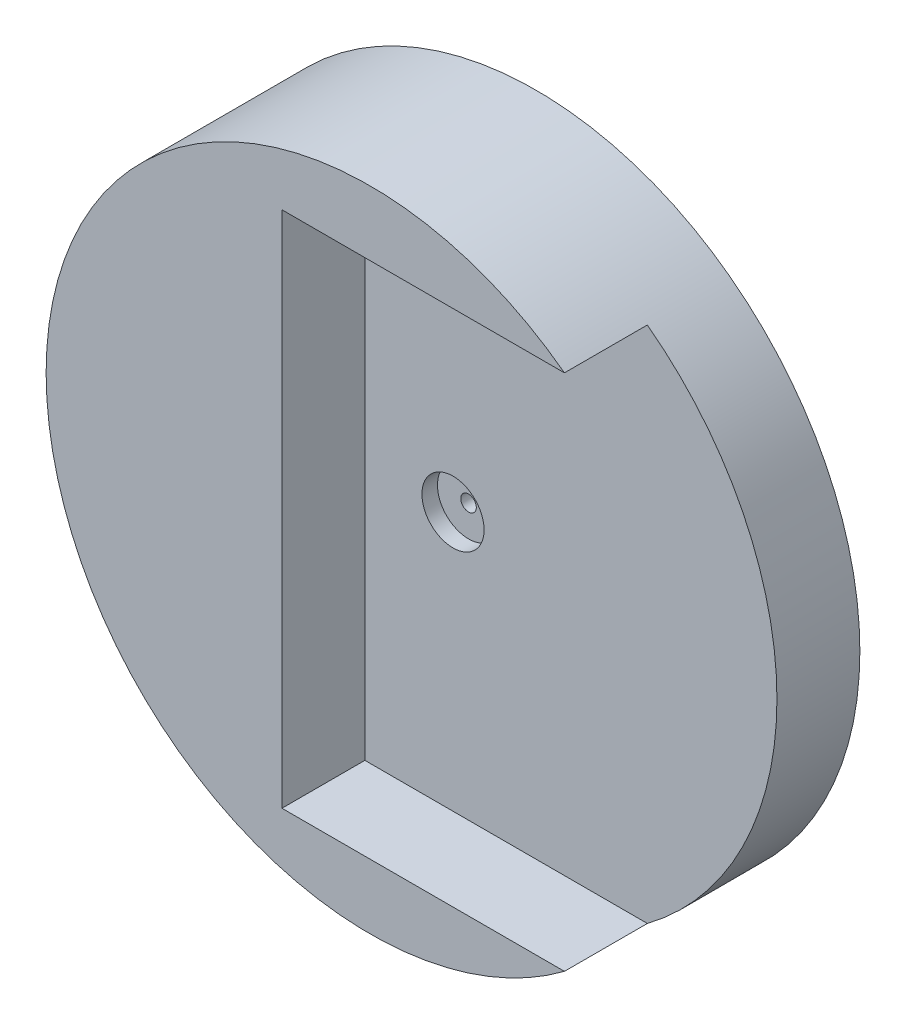
ISO-10303-21;
HEADER;
FILE_DESCRIPTION(('STEP AP214'),'2;1');
FILE_NAME('part.step','',(''),(''),'','','');
FILE_SCHEMA(('AUTOMOTIVE_DESIGN { 1 0 10303 214 1 1 1 1 }'));
ENDSEC;
DATA;
#1=APPLICATION_CONTEXT('core data for automotive mechanical design processes');
#2=APPLICATION_PROTOCOL_DEFINITION('international standard','automotive_design',2000,#1);
#3=PRODUCT_CONTEXT('',#1,'mechanical');
#4=PRODUCT('Part','Part','',(#3));
#5=PRODUCT_RELATED_PRODUCT_CATEGORY('part','',(#4));
#6=PRODUCT_DEFINITION_FORMATION('','',#4);
#7=PRODUCT_DEFINITION_CONTEXT('part definition',#1,'design');
#8=PRODUCT_DEFINITION('design','',#6,#7);
#9=PRODUCT_DEFINITION_SHAPE('','',#8);
#10=(LENGTH_UNIT() NAMED_UNIT(*) SI_UNIT(.MILLI.,.METRE.));
#11=(NAMED_UNIT(*) PLANE_ANGLE_UNIT() SI_UNIT($,.RADIAN.));
#12=(NAMED_UNIT(*) SI_UNIT($,.STERADIAN.) SOLID_ANGLE_UNIT());
#13=UNCERTAINTY_MEASURE_WITH_UNIT(LENGTH_MEASURE(1.E-05),#10,'distance_accuracy_value','');
#14=(GEOMETRIC_REPRESENTATION_CONTEXT(3) GLOBAL_UNCERTAINTY_ASSIGNED_CONTEXT((#13)) GLOBAL_UNIT_ASSIGNED_CONTEXT((#10,
#11,#12)) REPRESENTATION_CONTEXT('',''));
#15=CARTESIAN_POINT('',(0.,0.,0.));
#16=DIRECTION('',(0.,0.,1.));
#17=DIRECTION('',(1.,0.,0.));
#18=AXIS2_PLACEMENT_3D('',#15,#16,#17);
#19=CARTESIAN_POINT('',(0.,0.,32.));
#20=DIRECTION('',(0.,0.,-1.));
#21=DIRECTION('',(-1.,0.,0.));
#22=AXIS2_PLACEMENT_3D('',#19,#20,#21);
#23=CYLINDRICAL_SURFACE('',#22,1.5);
#24=CARTESIAN_POINT('',(0.,0.,10.));
#25=DIRECTION('',(0.,0.,-1.));
#26=DIRECTION('',(-1.,0.,0.));
#27=AXIS2_PLACEMENT_3D('',#24,#25,#26);
#28=CIRCLE('',#27,1.5);
#29=CARTESIAN_POINT('',(-1.5,0.,10.));
#30=VERTEX_POINT('',#29);
#31=EDGE_CURVE('E109',#30,#30,#28,.T.);
#32=ORIENTED_EDGE('',*,*,#31,.T.);
#33=EDGE_LOOP('',(#32));
#34=FACE_BOUND('',#33,.T.);
#35=CARTESIAN_POINT('',(0.,0.,13.));
#36=DIRECTION('',(0.,0.,1.));
#37=DIRECTION('',(1.,0.,0.));
#38=AXIS2_PLACEMENT_3D('',#35,#36,#37);
#39=CIRCLE('',#38,1.5);
#40=CARTESIAN_POINT('',(1.5,0.,13.));
#41=VERTEX_POINT('',#40);
#42=EDGE_CURVE('E37',#41,#41,#39,.F.);
#43=ORIENTED_EDGE('',*,*,#42,.F.);
#44=EDGE_LOOP('',(#43));
#45=FACE_BOUND('',#44,.T.);
#46=ADVANCED_FACE('F33',(#34,#45),#23,.F.);
#47=CARTESIAN_POINT('',(0.,0.,0.));
#48=DIRECTION('',(0.,0.,1.));
#49=DIRECTION('',(1.,0.,0.));
#50=AXIS2_PLACEMENT_3D('',#47,#48,#49);
#51=PLANE('',#50);
#52=CARTESIAN_POINT('',(0.,0.,0.));
#53=DIRECTION('',(0.,0.,1.));
#54=DIRECTION('',(1.,0.,0.));
#55=AXIS2_PLACEMENT_3D('',#52,#53,#54);
#56=CIRCLE('',#55,62.5);
#57=CARTESIAN_POINT('',(62.5,0.,0.));
#58=VERTEX_POINT('',#57);
#59=EDGE_CURVE('E11',#58,#58,#56,.T.);
#60=ORIENTED_EDGE('',*,*,#59,.F.);
#61=EDGE_LOOP('',(#60));
#62=FACE_BOUND('',#61,.T.);
#63=CARTESIAN_POINT('',(0.,0.,0.));
#64=DIRECTION('',(0.,0.,1.));
#65=DIRECTION('',(1.,0.,0.));
#66=AXIS2_PLACEMENT_3D('',#63,#64,#65);
#67=CIRCLE('',#66,57.5);
#68=CARTESIAN_POINT('',(57.5,0.,0.));
#69=VERTEX_POINT('',#68);
#70=EDGE_CURVE('E42',#69,#69,#67,.T.);
#71=ORIENTED_EDGE('',*,*,#70,.T.);
#72=EDGE_LOOP('',(#71));
#73=FACE_BOUND('',#72,.T.);
#74=ADVANCED_FACE('F121',(#62,#73),#51,.F.);
#75=CARTESIAN_POINT('',(0.,0.,10.));
#76=DIRECTION('',(0.,0.,-1.));
#77=DIRECTION('',(-1.,0.,0.));
#78=AXIS2_PLACEMENT_3D('',#75,#76,#77);
#79=CYLINDRICAL_SURFACE('',#78,62.5);
#80=CARTESIAN_POINT('',(0.,0.,32.));
#81=DIRECTION('',(0.,0.,1.));
#82=DIRECTION('',(1.,0.,0.));
#83=AXIS2_PLACEMENT_3D('',#80,#81,#82);
#84=CIRCLE('',#83,62.5);
#85=CARTESIAN_POINT('',(37.5,50.,32.));
#86=VERTEX_POINT('',#85);
#87=CARTESIAN_POINT('',(37.5,-50.,32.));
#88=VERTEX_POINT('',#87);
#89=EDGE_CURVE('E112',#86,#88,#84,.T.);
#90=ORIENTED_EDGE('',*,*,#89,.F.);
#91=DIRECTION('',(0.,0.,-1.));
#92=VECTOR('',#91,1.);
#93=CARTESIAN_POINT('',(37.5,50.,10.));
#94=LINE('',#93,#92);
#95=CARTESIAN_POINT('',(37.5,50.,16.));
#96=VERTEX_POINT('',#95);
#97=EDGE_CURVE('E106',#86,#96,#94,.T.);
#98=ORIENTED_EDGE('',*,*,#97,.T.);
#99=CARTESIAN_POINT('',(0.,0.,16.));
#100=DIRECTION('',(0.,0.,1.));
#101=DIRECTION('',(1.,0.,0.));
#102=AXIS2_PLACEMENT_3D('',#99,#100,#101);
#103=CIRCLE('',#102,62.5);
#104=CARTESIAN_POINT('',(37.5,-50.,16.));
#105=VERTEX_POINT('',#104);
#106=EDGE_CURVE('E102',#105,#96,#103,.T.);
#107=ORIENTED_EDGE('',*,*,#106,.F.);
#108=DIRECTION('',(0.,0.,-1.));
#109=VECTOR('',#108,1.);
#110=CARTESIAN_POINT('',(37.5,-50.,10.));
#111=LINE('',#110,#109);
#112=EDGE_CURVE('E57',#105,#88,#111,.F.);
#113=ORIENTED_EDGE('',*,*,#112,.T.);
#114=EDGE_LOOP('',(#90,#98,#107,#113));
#115=FACE_BOUND('',#114,.T.);
#116=ORIENTED_EDGE('',*,*,#59,.T.);
#117=EDGE_LOOP('',(#116));
#118=FACE_BOUND('',#117,.T.);
#119=ADVANCED_FACE('F35',(#115,#118),#79,.T.);
#120=CARTESIAN_POINT('',(0.,0.,10.));
#121=DIRECTION('',(0.,0.,-1.));
#122=DIRECTION('',(-1.,0.,0.));
#123=AXIS2_PLACEMENT_3D('',#120,#121,#122);
#124=CYLINDRICAL_SURFACE('',#123,57.5);
#125=CARTESIAN_POINT('',(0.,0.,10.));
#126=DIRECTION('',(0.,0.,1.));
#127=DIRECTION('',(1.,0.,0.));
#128=AXIS2_PLACEMENT_3D('',#125,#126,#127);
#129=CIRCLE('',#128,57.5);
#130=CARTESIAN_POINT('',(57.5,0.,10.));
#131=VERTEX_POINT('',#130);
#132=EDGE_CURVE('E115',#131,#131,#129,.T.);
#133=ORIENTED_EDGE('',*,*,#132,.T.);
#134=EDGE_LOOP('',(#133));
#135=FACE_BOUND('',#134,.T.);
#136=ORIENTED_EDGE('',*,*,#70,.F.);
#137=EDGE_LOOP('',(#136));
#138=FACE_BOUND('',#137,.T.);
#139=ADVANCED_FACE('F123',(#135,#138),#124,.F.);
#140=CARTESIAN_POINT('',(0.,0.,10.));
#141=DIRECTION('',(0.,0.,1.));
#142=DIRECTION('',(1.,0.,0.));
#143=AXIS2_PLACEMENT_3D('',#140,#141,#142);
#144=PLANE('',#143);
#145=ORIENTED_EDGE('',*,*,#31,.F.);
#146=EDGE_LOOP('',(#145));
#147=FACE_BOUND('',#146,.T.);
#148=ORIENTED_EDGE('',*,*,#132,.F.);
#149=EDGE_LOOP('',(#148));
#150=FACE_BOUND('',#149,.T.);
#151=ADVANCED_FACE('F125',(#147,#150),#144,.F.);
#152=CARTESIAN_POINT('',(0.,0.,32.));
#153=DIRECTION('',(0.,0.,1.));
#154=DIRECTION('',(1.,0.,0.));
#155=AXIS2_PLACEMENT_3D('',#152,#153,#154);
#156=PLANE('',#155);
#157=DIRECTION('',(-1.,0.,0.));
#158=VECTOR('',#157,1.);
#159=CARTESIAN_POINT('',(-17.,50.,32.));
#160=LINE('',#159,#158);
#161=CARTESIAN_POINT('',(-17.,50.,32.));
#162=VERTEX_POINT('',#161);
#163=EDGE_CURVE('E91',#86,#162,#160,.T.);
#164=ORIENTED_EDGE('',*,*,#163,.F.);
#165=ORIENTED_EDGE('',*,*,#89,.T.);
#166=DIRECTION('',(1.,0.,0.));
#167=VECTOR('',#166,1.);
#168=CARTESIAN_POINT('',(-17.,-50.,32.));
#169=LINE('',#168,#167);
#170=CARTESIAN_POINT('',(-17.,-50.,32.));
#171=VERTEX_POINT('',#170);
#172=EDGE_CURVE('E93',#171,#88,#169,.T.);
#173=ORIENTED_EDGE('',*,*,#172,.F.);
#174=DIRECTION('',(0.,-1.,0.));
#175=VECTOR('',#174,1.);
#176=CARTESIAN_POINT('',(-17.,50.,32.));
#177=LINE('',#176,#175);
#178=EDGE_CURVE('E49',#162,#171,#177,.T.);
#179=ORIENTED_EDGE('',*,*,#178,.F.);
#180=EDGE_LOOP('',(#164,#165,#173,#179));
#181=FACE_BOUND('',#180,.T.);
#182=ADVANCED_FACE('F132',(#181),#156,.T.);
#183=CARTESIAN_POINT('',(-17.,50.,16.));
#184=DIRECTION('',(0.,1.,0.));
#185=DIRECTION('',(0.,0.,1.));
#186=AXIS2_PLACEMENT_3D('',#183,#184,#185);
#187=PLANE('',#186);
#188=ORIENTED_EDGE('',*,*,#163,.T.);
#189=DIRECTION('',(0.,0.,1.));
#190=VECTOR('',#189,1.);
#191=CARTESIAN_POINT('',(-17.,50.,16.));
#192=LINE('',#191,#190);
#193=CARTESIAN_POINT('',(-17.,50.,16.));
#194=VERTEX_POINT('',#193);
#195=EDGE_CURVE('E80',#194,#162,#192,.T.);
#196=ORIENTED_EDGE('',*,*,#195,.F.);
#197=DIRECTION('',(-1.,0.,0.));
#198=VECTOR('',#197,1.);
#199=CARTESIAN_POINT('',(-17.,50.,16.));
#200=LINE('',#199,#198);
#201=EDGE_CURVE('E81',#96,#194,#200,.T.);
#202=ORIENTED_EDGE('',*,*,#201,.F.);
#203=ORIENTED_EDGE('',*,*,#97,.F.);
#204=EDGE_LOOP('',(#188,#196,#202,#203));
#205=FACE_BOUND('',#204,.T.);
#206=ADVANCED_FACE('F148',(#205),#187,.F.);
#207=CARTESIAN_POINT('',(-17.,-50.,16.));
#208=DIRECTION('',(0.,-1.,0.));
#209=DIRECTION('',(1.,0.,0.));
#210=AXIS2_PLACEMENT_3D('',#207,#208,#209);
#211=PLANE('',#210);
#212=DIRECTION('',(1.,0.,0.));
#213=VECTOR('',#212,1.);
#214=CARTESIAN_POINT('',(-17.,-50.,16.));
#215=LINE('',#214,#213);
#216=CARTESIAN_POINT('',(-17.,-50.,16.));
#217=VERTEX_POINT('',#216);
#218=EDGE_CURVE('E83',#217,#105,#215,.T.);
#219=ORIENTED_EDGE('',*,*,#218,.F.);
#220=DIRECTION('',(0.,0.,1.));
#221=VECTOR('',#220,1.);
#222=CARTESIAN_POINT('',(-17.,-50.,16.));
#223=LINE('',#222,#221);
#224=EDGE_CURVE('E75',#217,#171,#223,.T.);
#225=ORIENTED_EDGE('',*,*,#224,.T.);
#226=ORIENTED_EDGE('',*,*,#172,.T.);
#227=ORIENTED_EDGE('',*,*,#112,.F.);
#228=EDGE_LOOP('',(#219,#225,#226,#227));
#229=FACE_BOUND('',#228,.T.);
#230=ADVANCED_FACE('F84',(#229),#211,.F.);
#231=CARTESIAN_POINT('',(0.,0.,16.));
#232=DIRECTION('',(0.,0.,1.));
#233=DIRECTION('',(1.,0.,0.));
#234=AXIS2_PLACEMENT_3D('',#231,#232,#233);
#235=PLANE('',#234);
#236=CARTESIAN_POINT('',(0.,0.,16.));
#237=DIRECTION('',(0.,0.,1.));
#238=DIRECTION('',(1.,0.,0.));
#239=AXIS2_PLACEMENT_3D('',#236,#237,#238);
#240=CIRCLE('',#239,6.);
#241=CARTESIAN_POINT('',(6.,0.,16.));
#242=VERTEX_POINT('',#241);
#243=EDGE_CURVE('E96',#242,#242,#240,.T.);
#244=ORIENTED_EDGE('',*,*,#243,.F.);
#245=EDGE_LOOP('',(#244));
#246=FACE_BOUND('',#245,.T.);
#247=ORIENTED_EDGE('',*,*,#106,.T.);
#248=ORIENTED_EDGE('',*,*,#201,.T.);
#249=DIRECTION('',(0.,-1.,0.));
#250=VECTOR('',#249,1.);
#251=CARTESIAN_POINT('',(-17.,50.,16.));
#252=LINE('',#251,#250);
#253=EDGE_CURVE('E78',#194,#217,#252,.T.);
#254=ORIENTED_EDGE('',*,*,#253,.T.);
#255=ORIENTED_EDGE('',*,*,#218,.T.);
#256=EDGE_LOOP('',(#247,#248,#254,#255));
#257=FACE_BOUND('',#256,.T.);
#258=ADVANCED_FACE('F88',(#246,#257),#235,.T.);
#259=CARTESIAN_POINT('',(-17.,50.,16.));
#260=DIRECTION('',(-1.,0.,0.));
#261=DIRECTION('',(0.,-1.,0.));
#262=AXIS2_PLACEMENT_3D('',#259,#260,#261);
#263=PLANE('',#262);
#264=ORIENTED_EDGE('',*,*,#178,.T.);
#265=ORIENTED_EDGE('',*,*,#224,.F.);
#266=ORIENTED_EDGE('',*,*,#253,.F.);
#267=ORIENTED_EDGE('',*,*,#195,.T.);
#268=EDGE_LOOP('',(#264,#265,#266,#267));
#269=FACE_BOUND('',#268,.T.);
#270=ADVANCED_FACE('F76',(#269),#263,.F.);
#271=CARTESIAN_POINT('',(0.,0.,13.));
#272=DIRECTION('',(0.,0.,1.));
#273=DIRECTION('',(1.,0.,0.));
#274=AXIS2_PLACEMENT_3D('',#271,#272,#273);
#275=PLANE('',#274);
#276=CARTESIAN_POINT('',(0.,0.,13.));
#277=DIRECTION('',(0.,0.,1.));
#278=DIRECTION('',(1.,0.,0.));
#279=AXIS2_PLACEMENT_3D('',#276,#277,#278);
#280=CIRCLE('',#279,6.);
#281=CARTESIAN_POINT('',(6.,0.,13.));
#282=VERTEX_POINT('',#281);
#283=EDGE_CURVE('E179',#282,#282,#280,.T.);
#284=ORIENTED_EDGE('',*,*,#283,.T.);
#285=EDGE_LOOP('',(#284));
#286=FACE_BOUND('',#285,.T.);
#287=ORIENTED_EDGE('',*,*,#42,.T.);
#288=EDGE_LOOP('',(#287));
#289=FACE_BOUND('',#288,.T.);
#290=ADVANCED_FACE('F169',(#286,#289),#275,.T.);
#291=CARTESIAN_POINT('',(0.,0.,13.));
#292=DIRECTION('',(0.,0.,1.));
#293=DIRECTION('',(1.,0.,0.));
#294=AXIS2_PLACEMENT_3D('',#291,#292,#293);
#295=CYLINDRICAL_SURFACE('',#294,6.);
#296=ORIENTED_EDGE('',*,*,#283,.F.);
#297=EDGE_LOOP('',(#296));
#298=FACE_BOUND('',#297,.T.);
#299=ORIENTED_EDGE('',*,*,#243,.T.);
#300=EDGE_LOOP('',(#299));
#301=FACE_BOUND('',#300,.T.);
#302=ADVANCED_FACE('F166',(#298,#301),#295,.F.);
#303=CLOSED_SHELL('',(#46,#74,#119,#139,#151,#182,#206,#230,#258,#270,#290,#302));
#304=MANIFOLD_SOLID_BREP('B2',#303);
#305=ADVANCED_BREP_SHAPE_REPRESENTATION('',(#18,#304),#14);
#306=SHAPE_DEFINITION_REPRESENTATION(#9,#305);
ENDSEC;
END-ISO-10303-21;
